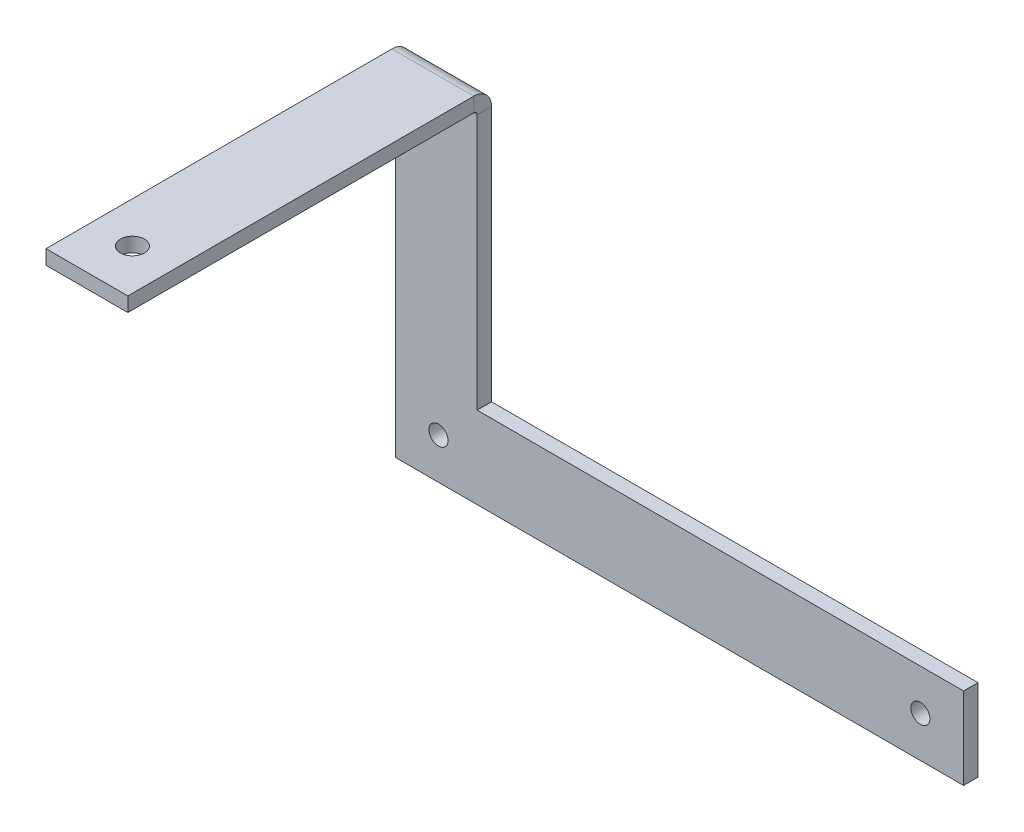
ISO-10303-21;
HEADER;
FILE_DESCRIPTION(('STEP AP214'),'2;1');
FILE_NAME('part.step','',(''),(''),'','','');
FILE_SCHEMA(('AUTOMOTIVE_DESIGN { 1 0 10303 214 1 1 1 1 }'));
ENDSEC;
DATA;
#1=APPLICATION_CONTEXT('core data for automotive mechanical design processes');
#2=APPLICATION_PROTOCOL_DEFINITION('international standard','automotive_design',2000,#1);
#3=PRODUCT_CONTEXT('',#1,'mechanical');
#4=PRODUCT('Part','Part','',(#3));
#5=PRODUCT_RELATED_PRODUCT_CATEGORY('part','',(#4));
#6=PRODUCT_DEFINITION_FORMATION('','',#4);
#7=PRODUCT_DEFINITION_CONTEXT('part definition',#1,'design');
#8=PRODUCT_DEFINITION('design','',#6,#7);
#9=PRODUCT_DEFINITION_SHAPE('','',#8);
#10=(LENGTH_UNIT() NAMED_UNIT(*) SI_UNIT(.MILLI.,.METRE.));
#11=(NAMED_UNIT(*) PLANE_ANGLE_UNIT() SI_UNIT($,.RADIAN.));
#12=(NAMED_UNIT(*) SI_UNIT($,.STERADIAN.) SOLID_ANGLE_UNIT());
#13=UNCERTAINTY_MEASURE_WITH_UNIT(LENGTH_MEASURE(1.E-05),#10,'distance_accuracy_value','');
#14=(GEOMETRIC_REPRESENTATION_CONTEXT(3) GLOBAL_UNCERTAINTY_ASSIGNED_CONTEXT((#13)) GLOBAL_UNIT_ASSIGNED_CONTEXT((#10,
#11,#12)) REPRESENTATION_CONTEXT('',''));
#15=CARTESIAN_POINT('',(0.,0.,0.));
#16=DIRECTION('',(0.,0.,1.));
#17=DIRECTION('',(1.,0.,0.));
#18=AXIS2_PLACEMENT_3D('',#15,#16,#17);
#19=CARTESIAN_POINT('',(0.,75.,-3.175));
#20=DIRECTION('',(-1.,0.,0.));
#21=DIRECTION('',(0.,0.,1.));
#22=AXIS2_PLACEMENT_3D('',#19,#20,#21);
#23=PLANE('',#22);
#24=DIRECTION('',(0.,-1.,0.));
#25=VECTOR('',#24,1.);
#26=CARTESIAN_POINT('',(0.,75.,0.));
#27=LINE('',#26,#25);
#28=CARTESIAN_POINT('',(0.,74.2634,0.));
#29=VERTEX_POINT('',#28);
#30=CARTESIAN_POINT('',(0.,0.,0.));
#31=VERTEX_POINT('',#30);
#32=EDGE_CURVE('E94',#29,#31,#27,.T.);
#33=ORIENTED_EDGE('',*,*,#32,.F.);
#34=DIRECTION('',(0.,0.,-1.));
#35=VECTOR('',#34,1.);
#36=CARTESIAN_POINT('',(0.,74.2634,0.));
#37=LINE('',#36,#35);
#38=CARTESIAN_POINT('',(0.,74.2634,-3.175));
#39=VERTEX_POINT('',#38);
#40=EDGE_CURVE('E190',#29,#39,#37,.T.);
#41=ORIENTED_EDGE('',*,*,#40,.T.);
#42=DIRECTION('',(0.,-1.,0.));
#43=VECTOR('',#42,1.);
#44=CARTESIAN_POINT('',(0.,75.,-3.175));
#45=LINE('',#44,#43);
#46=CARTESIAN_POINT('',(0.,0.,-3.175));
#47=VERTEX_POINT('',#46);
#48=EDGE_CURVE('E75',#39,#47,#45,.T.);
#49=ORIENTED_EDGE('',*,*,#48,.T.);
#50=DIRECTION('',(0.,0.,1.));
#51=VECTOR('',#50,1.);
#52=CARTESIAN_POINT('',(0.,0.,-3.175));
#53=LINE('',#52,#51);
#54=EDGE_CURVE('E11',#47,#31,#53,.T.);
#55=ORIENTED_EDGE('',*,*,#54,.T.);
#56=EDGE_LOOP('',(#33,#41,#49,#55));
#57=FACE_BOUND('',#56,.T.);
#58=ADVANCED_FACE('F49',(#57),#23,.T.);
#59=CARTESIAN_POINT('',(0.,0.,-3.175));
#60=DIRECTION('',(0.,0.,1.));
#61=DIRECTION('',(1.,0.,0.));
#62=AXIS2_PLACEMENT_3D('',#59,#60,#61);
#63=PLANE('',#62);
#64=CARTESIAN_POINT('',(9.5,9.,-3.175));
#65=DIRECTION('',(0.,0.,1.));
#66=DIRECTION('',(1.,0.,0.));
#67=AXIS2_PLACEMENT_3D('',#64,#65,#66);
#68=CIRCLE('',#67,2.09999999999999);
#69=CARTESIAN_POINT('',(11.6,9.,-3.175));
#70=VERTEX_POINT('',#69);
#71=EDGE_CURVE('E339',#70,#70,#68,.T.);
#72=ORIENTED_EDGE('',*,*,#71,.T.);
#73=EDGE_LOOP('',(#72));
#74=FACE_BOUND('',#73,.T.);
#75=CARTESIAN_POINT('',(115.5,9.,-3.175));
#76=DIRECTION('',(0.,0.,1.));
#77=DIRECTION('',(1.,0.,0.));
#78=AXIS2_PLACEMENT_3D('',#75,#76,#77);
#79=CIRCLE('',#78,2.09999999999999);
#80=CARTESIAN_POINT('',(117.6,9.,-3.175));
#81=VERTEX_POINT('',#80);
#82=EDGE_CURVE('E350',#81,#81,#79,.T.);
#83=ORIENTED_EDGE('',*,*,#82,.T.);
#84=EDGE_LOOP('',(#83));
#85=FACE_BOUND('',#84,.T.);
#86=DIRECTION('',(-1.,0.,0.));
#87=VECTOR('',#86,1.);
#88=CARTESIAN_POINT('',(0.,74.2634,-3.175));
#89=LINE('',#88,#87);
#90=CARTESIAN_POINT('',(18.,74.2634,-3.175));
#91=VERTEX_POINT('',#90);
#92=EDGE_CURVE('E182',#39,#91,#89,.F.);
#93=ORIENTED_EDGE('',*,*,#92,.T.);
#94=DIRECTION('',(0.,1.,0.));
#95=VECTOR('',#94,1.);
#96=CARTESIAN_POINT('',(18.,18.,-3.175));
#97=LINE('',#96,#95);
#98=CARTESIAN_POINT('',(18.,18.,-3.175));
#99=VERTEX_POINT('',#98);
#100=EDGE_CURVE('E221',#99,#91,#97,.T.);
#101=ORIENTED_EDGE('',*,*,#100,.F.);
#102=DIRECTION('',(-1.,0.,0.));
#103=VECTOR('',#102,1.);
#104=CARTESIAN_POINT('',(18.,18.,-3.175));
#105=LINE('',#104,#103);
#106=CARTESIAN_POINT('',(125.,18.,-3.175));
#107=VERTEX_POINT('',#106);
#108=EDGE_CURVE('E217',#107,#99,#105,.T.);
#109=ORIENTED_EDGE('',*,*,#108,.F.);
#110=DIRECTION('',(0.,1.,0.));
#111=VECTOR('',#110,1.);
#112=CARTESIAN_POINT('',(125.,0.,-3.175));
#113=LINE('',#112,#111);
#114=CARTESIAN_POINT('',(125.,0.,-3.175));
#115=VERTEX_POINT('',#114);
#116=EDGE_CURVE('E214',#115,#107,#113,.T.);
#117=ORIENTED_EDGE('',*,*,#116,.F.);
#118=DIRECTION('',(1.,0.,0.));
#119=VECTOR('',#118,1.);
#120=CARTESIAN_POINT('',(0.,0.,-3.175));
#121=LINE('',#120,#119);
#122=EDGE_CURVE('E210',#47,#115,#121,.T.);
#123=ORIENTED_EDGE('',*,*,#122,.F.);
#124=ORIENTED_EDGE('',*,*,#48,.F.);
#125=EDGE_LOOP('',(#93,#101,#109,#117,#123,#124));
#126=FACE_BOUND('',#125,.T.);
#127=ADVANCED_FACE('F255',(#74,#85,#126),#63,.F.);
#128=CARTESIAN_POINT('',(0.,0.,0.));
#129=DIRECTION('',(0.,0.,1.));
#130=DIRECTION('',(1.,0.,0.));
#131=AXIS2_PLACEMENT_3D('',#128,#129,#130);
#132=PLANE('',#131);
#133=CARTESIAN_POINT('',(9.5,9.,0.));
#134=DIRECTION('',(0.,0.,1.));
#135=DIRECTION('',(1.,0.,0.));
#136=AXIS2_PLACEMENT_3D('',#133,#134,#135);
#137=CIRCLE('',#136,2.09999999999999);
#138=CARTESIAN_POINT('',(11.6,9.,0.));
#139=VERTEX_POINT('',#138);
#140=EDGE_CURVE('E335',#139,#139,#137,.T.);
#141=ORIENTED_EDGE('',*,*,#140,.F.);
#142=EDGE_LOOP('',(#141));
#143=FACE_BOUND('',#142,.T.);
#144=CARTESIAN_POINT('',(115.5,9.,0.));
#145=DIRECTION('',(0.,0.,1.));
#146=DIRECTION('',(1.,0.,0.));
#147=AXIS2_PLACEMENT_3D('',#144,#145,#146);
#148=CIRCLE('',#147,2.09999999999999);
#149=CARTESIAN_POINT('',(117.6,9.,0.));
#150=VERTEX_POINT('',#149);
#151=EDGE_CURVE('E346',#150,#150,#148,.T.);
#152=ORIENTED_EDGE('',*,*,#151,.F.);
#153=EDGE_LOOP('',(#152));
#154=FACE_BOUND('',#153,.T.);
#155=DIRECTION('',(0.,1.,0.));
#156=VECTOR('',#155,1.);
#157=CARTESIAN_POINT('',(18.,18.,0.));
#158=LINE('',#157,#156);
#159=CARTESIAN_POINT('',(18.,18.,0.));
#160=VERTEX_POINT('',#159);
#161=CARTESIAN_POINT('',(18.,74.2634,0.));
#162=VERTEX_POINT('',#161);
#163=EDGE_CURVE('E237',#160,#162,#158,.T.);
#164=ORIENTED_EDGE('',*,*,#163,.T.);
#165=DIRECTION('',(-1.,0.,0.));
#166=VECTOR('',#165,1.);
#167=CARTESIAN_POINT('',(0.,74.2634,0.));
#168=LINE('',#167,#166);
#169=EDGE_CURVE('E67',#29,#162,#168,.F.);
#170=ORIENTED_EDGE('',*,*,#169,.F.);
#171=ORIENTED_EDGE('',*,*,#32,.T.);
#172=DIRECTION('',(1.,0.,0.));
#173=VECTOR('',#172,1.);
#174=CARTESIAN_POINT('',(0.,0.,0.));
#175=LINE('',#174,#173);
#176=CARTESIAN_POINT('',(125.,0.,0.));
#177=VERTEX_POINT('',#176);
#178=EDGE_CURVE('E207',#31,#177,#175,.T.);
#179=ORIENTED_EDGE('',*,*,#178,.T.);
#180=DIRECTION('',(0.,1.,0.));
#181=VECTOR('',#180,1.);
#182=CARTESIAN_POINT('',(125.,0.,0.));
#183=LINE('',#182,#181);
#184=CARTESIAN_POINT('',(125.,18.,0.));
#185=VERTEX_POINT('',#184);
#186=EDGE_CURVE('E229',#177,#185,#183,.T.);
#187=ORIENTED_EDGE('',*,*,#186,.T.);
#188=DIRECTION('',(-1.,0.,0.));
#189=VECTOR('',#188,1.);
#190=CARTESIAN_POINT('',(18.,18.,0.));
#191=LINE('',#190,#189);
#192=EDGE_CURVE('E233',#185,#160,#191,.T.);
#193=ORIENTED_EDGE('',*,*,#192,.T.);
#194=EDGE_LOOP('',(#164,#170,#171,#179,#187,#193));
#195=FACE_BOUND('',#194,.T.);
#196=ADVANCED_FACE('F252',(#143,#154,#195),#132,.T.);
#197=CARTESIAN_POINT('',(0.,0.,-3.175));
#198=DIRECTION('',(0.,-1.,0.));
#199=DIRECTION('',(0.,0.,-1.));
#200=AXIS2_PLACEMENT_3D('',#197,#198,#199);
#201=PLANE('',#200);
#202=ORIENTED_EDGE('',*,*,#178,.F.);
#203=ORIENTED_EDGE('',*,*,#54,.F.);
#204=ORIENTED_EDGE('',*,*,#122,.T.);
#205=DIRECTION('',(0.,0.,1.));
#206=VECTOR('',#205,1.);
#207=CARTESIAN_POINT('',(125.,0.,-3.175));
#208=LINE('',#207,#206);
#209=EDGE_CURVE('E100',#115,#177,#208,.T.);
#210=ORIENTED_EDGE('',*,*,#209,.T.);
#211=EDGE_LOOP('',(#202,#203,#204,#210));
#212=FACE_BOUND('',#211,.T.);
#213=ADVANCED_FACE('F51',(#212),#201,.T.);
#214=CARTESIAN_POINT('',(18.,18.,-3.175));
#215=DIRECTION('',(1.,0.,0.));
#216=DIRECTION('',(0.,0.,-1.));
#217=AXIS2_PLACEMENT_3D('',#214,#215,#216);
#218=PLANE('',#217);
#219=DIRECTION('',(0.,0.,-1.));
#220=VECTOR('',#219,1.);
#221=CARTESIAN_POINT('',(18.,74.2634,0.));
#222=LINE('',#221,#220);
#223=EDGE_CURVE('E203',#162,#91,#222,.T.);
#224=ORIENTED_EDGE('',*,*,#223,.F.);
#225=ORIENTED_EDGE('',*,*,#163,.F.);
#226=DIRECTION('',(0.,0.,1.));
#227=VECTOR('',#226,1.);
#228=CARTESIAN_POINT('',(18.,18.,-3.175));
#229=LINE('',#228,#227);
#230=EDGE_CURVE('E59',#99,#160,#229,.T.);
#231=ORIENTED_EDGE('',*,*,#230,.F.);
#232=ORIENTED_EDGE('',*,*,#100,.T.);
#233=EDGE_LOOP('',(#224,#225,#231,#232));
#234=FACE_BOUND('',#233,.T.);
#235=ADVANCED_FACE('F263',(#234),#218,.T.);
#236=CARTESIAN_POINT('',(18.,18.,-3.175));
#237=DIRECTION('',(0.,1.,0.));
#238=DIRECTION('',(0.,0.,1.));
#239=AXIS2_PLACEMENT_3D('',#236,#237,#238);
#240=PLANE('',#239);
#241=ORIENTED_EDGE('',*,*,#192,.F.);
#242=DIRECTION('',(0.,0.,1.));
#243=VECTOR('',#242,1.);
#244=CARTESIAN_POINT('',(125.,18.,-3.175));
#245=LINE('',#244,#243);
#246=EDGE_CURVE('E244',#107,#185,#245,.T.);
#247=ORIENTED_EDGE('',*,*,#246,.F.);
#248=ORIENTED_EDGE('',*,*,#108,.T.);
#249=ORIENTED_EDGE('',*,*,#230,.T.);
#250=EDGE_LOOP('',(#241,#247,#248,#249));
#251=FACE_BOUND('',#250,.T.);
#252=ADVANCED_FACE('F276',(#251),#240,.T.);
#253=CARTESIAN_POINT('',(125.,0.,-3.175));
#254=DIRECTION('',(1.,0.,0.));
#255=DIRECTION('',(0.,0.,-1.));
#256=AXIS2_PLACEMENT_3D('',#253,#254,#255);
#257=PLANE('',#256);
#258=ORIENTED_EDGE('',*,*,#186,.F.);
#259=ORIENTED_EDGE('',*,*,#209,.F.);
#260=ORIENTED_EDGE('',*,*,#116,.T.);
#261=ORIENTED_EDGE('',*,*,#246,.T.);
#262=EDGE_LOOP('',(#258,#259,#260,#261));
#263=FACE_BOUND('',#262,.T.);
#264=ADVANCED_FACE('F250',(#263),#257,.T.);
#265=CARTESIAN_POINT('',(18.,74.2634,0.736600000000006));
#266=DIRECTION('',(1.,0.,0.));
#267=DIRECTION('',(0.,0.,-1.));
#268=AXIS2_PLACEMENT_3D('',#265,#266,#267);
#269=PLANE('',#268);
#270=DIRECTION('',(0.,1.,0.));
#271=VECTOR('',#270,1.);
#272=CARTESIAN_POINT('',(18.,75.,0.736600000000004));
#273=LINE('',#272,#271);
#274=CARTESIAN_POINT('',(18.,75.,0.736600000000004));
#275=VERTEX_POINT('',#274);
#276=CARTESIAN_POINT('',(18.,78.175,0.736599999999993));
#277=VERTEX_POINT('',#276);
#278=EDGE_CURVE('E144',#275,#277,#273,.T.);
#279=ORIENTED_EDGE('',*,*,#278,.F.);
#280=CARTESIAN_POINT('',(18.,74.2634,0.736600000000006));
#281=DIRECTION('',(-1.,0.,0.));
#282=DIRECTION('',(0.,0.,1.));
#283=AXIS2_PLACEMENT_3D('',#280,#281,#282);
#284=CIRCLE('',#283,0.736600000000004);
#285=EDGE_CURVE('E194',#162,#275,#284,.F.);
#286=ORIENTED_EDGE('',*,*,#285,.F.);
#287=ORIENTED_EDGE('',*,*,#223,.T.);
#288=CARTESIAN_POINT('',(18.,74.2634,0.736600000000006));
#289=DIRECTION('',(-1.,0.,0.));
#290=DIRECTION('',(0.,0.,1.));
#291=AXIS2_PLACEMENT_3D('',#288,#289,#290);
#292=CIRCLE('',#291,3.9116);
#293=EDGE_CURVE('E185',#91,#277,#292,.F.);
#294=ORIENTED_EDGE('',*,*,#293,.T.);
#295=EDGE_LOOP('',(#279,#286,#287,#294));
#296=FACE_BOUND('',#295,.T.);
#297=ADVANCED_FACE('F280',(#296),#269,.T.);
#298=CARTESIAN_POINT('',(0.,74.2634,0.736600000000006));
#299=DIRECTION('',(1.,0.,0.));
#300=DIRECTION('',(0.,0.,-1.));
#301=AXIS2_PLACEMENT_3D('',#298,#299,#300);
#302=PLANE('',#301);
#303=CARTESIAN_POINT('',(0.,74.2634,0.736600000000006));
#304=DIRECTION('',(-1.,0.,0.));
#305=DIRECTION('',(0.,0.,1.));
#306=AXIS2_PLACEMENT_3D('',#303,#304,#305);
#307=CIRCLE('',#306,0.736600000000004);
#308=CARTESIAN_POINT('',(0.,75.,0.736600000000004));
#309=VERTEX_POINT('',#308);
#310=EDGE_CURVE('E180',#309,#29,#307,.T.);
#311=ORIENTED_EDGE('',*,*,#310,.F.);
#312=DIRECTION('',(0.,1.,0.));
#313=VECTOR('',#312,1.);
#314=CARTESIAN_POINT('',(0.,75.,0.736600000000004));
#315=LINE('',#314,#313);
#316=CARTESIAN_POINT('',(0.,78.175,0.736599999999993));
#317=VERTEX_POINT('',#316);
#318=EDGE_CURVE('E357',#309,#317,#315,.T.);
#319=ORIENTED_EDGE('',*,*,#318,.T.);
#320=CARTESIAN_POINT('',(0.,74.2634,0.736600000000006));
#321=DIRECTION('',(-1.,0.,0.));
#322=DIRECTION('',(0.,0.,1.));
#323=AXIS2_PLACEMENT_3D('',#320,#321,#322);
#324=CIRCLE('',#323,3.9116);
#325=EDGE_CURVE('E186',#317,#39,#324,.T.);
#326=ORIENTED_EDGE('',*,*,#325,.T.);
#327=ORIENTED_EDGE('',*,*,#40,.F.);
#328=EDGE_LOOP('',(#311,#319,#326,#327));
#329=FACE_BOUND('',#328,.T.);
#330=ADVANCED_FACE('F284',(#329),#302,.F.);
#331=CARTESIAN_POINT('',(0.,74.2634,0.736600000000006));
#332=DIRECTION('',(-1.,0.,0.));
#333=DIRECTION('',(0.,1.,0.));
#334=AXIS2_PLACEMENT_3D('',#331,#332,#333);
#335=CYLINDRICAL_SURFACE('',#334,3.9116);
#336=ORIENTED_EDGE('',*,*,#92,.F.);
#337=ORIENTED_EDGE('',*,*,#325,.F.);
#338=DIRECTION('',(-1.,0.,0.));
#339=VECTOR('',#338,1.);
#340=CARTESIAN_POINT('',(0.,78.175,0.736599999999993));
#341=LINE('',#340,#339);
#342=EDGE_CURVE('E173',#277,#317,#341,.T.);
#343=ORIENTED_EDGE('',*,*,#342,.F.);
#344=ORIENTED_EDGE('',*,*,#293,.F.);
#345=EDGE_LOOP('',(#336,#337,#343,#344));
#346=FACE_BOUND('',#345,.T.);
#347=ADVANCED_FACE('F290',(#346),#335,.T.);
#348=CARTESIAN_POINT('',(0.,74.2634,0.736600000000006));
#349=DIRECTION('',(-1.,0.,0.));
#350=DIRECTION('',(0.,1.,0.));
#351=AXIS2_PLACEMENT_3D('',#348,#349,#350);
#352=CYLINDRICAL_SURFACE('',#351,0.736600000000004);
#353=ORIENTED_EDGE('',*,*,#169,.T.);
#354=ORIENTED_EDGE('',*,*,#285,.T.);
#355=DIRECTION('',(-1.,0.,0.));
#356=VECTOR('',#355,1.);
#357=CARTESIAN_POINT('',(18.,75.,0.736600000000004));
#358=LINE('',#357,#356);
#359=EDGE_CURVE('E354',#275,#309,#358,.T.);
#360=ORIENTED_EDGE('',*,*,#359,.T.);
#361=ORIENTED_EDGE('',*,*,#310,.T.);
#362=EDGE_LOOP('',(#353,#354,#360,#361));
#363=FACE_BOUND('',#362,.T.);
#364=ADVANCED_FACE('F294',(#363),#352,.F.);
#365=CARTESIAN_POINT('',(0.,78.175,0.));
#366=DIRECTION('',(-1.,0.,0.));
#367=DIRECTION('',(0.,0.,1.));
#368=AXIS2_PLACEMENT_3D('',#365,#366,#367);
#369=PLANE('',#368);
#370=DIRECTION('',(0.,0.,-1.));
#371=VECTOR('',#370,1.);
#372=CARTESIAN_POINT('',(0.,78.175,0.));
#373=LINE('',#372,#371);
#374=CARTESIAN_POINT('',(0.,78.1750000000003,76.825));
#375=VERTEX_POINT('',#374);
#376=EDGE_CURVE('E160',#375,#317,#373,.T.);
#377=ORIENTED_EDGE('',*,*,#376,.T.);
#378=ORIENTED_EDGE('',*,*,#318,.F.);
#379=DIRECTION('',(0.,0.,-1.));
#380=VECTOR('',#379,1.);
#381=CARTESIAN_POINT('',(0.,75.,0.));
#382=LINE('',#381,#380);
#383=CARTESIAN_POINT('',(0.,75.0000000000003,76.825));
#384=VERTEX_POINT('',#383);
#385=EDGE_CURVE('E150',#384,#309,#382,.T.);
#386=ORIENTED_EDGE('',*,*,#385,.F.);
#387=DIRECTION('',(0.,-1.,0.));
#388=VECTOR('',#387,1.);
#389=CARTESIAN_POINT('',(0.,78.1750000000003,76.825));
#390=LINE('',#389,#388);
#391=EDGE_CURVE('E159',#375,#384,#390,.T.);
#392=ORIENTED_EDGE('',*,*,#391,.F.);
#393=EDGE_LOOP('',(#377,#378,#386,#392));
#394=FACE_BOUND('',#393,.T.);
#395=ADVANCED_FACE('F297',(#394),#369,.T.);
#396=CARTESIAN_POINT('',(18.,78.1750000000003,76.825));
#397=DIRECTION('',(1.,0.,0.));
#398=DIRECTION('',(0.,0.,-1.));
#399=AXIS2_PLACEMENT_3D('',#396,#397,#398);
#400=PLANE('',#399);
#401=DIRECTION('',(0.,0.,1.));
#402=VECTOR('',#401,1.);
#403=CARTESIAN_POINT('',(18.,75.0000000000003,76.825));
#404=LINE('',#403,#402);
#405=CARTESIAN_POINT('',(18.,75.0000000000003,76.825));
#406=VERTEX_POINT('',#405);
#407=EDGE_CURVE('E170',#275,#406,#404,.T.);
#408=ORIENTED_EDGE('',*,*,#407,.F.);
#409=ORIENTED_EDGE('',*,*,#278,.T.);
#410=DIRECTION('',(0.,0.,1.));
#411=VECTOR('',#410,1.);
#412=CARTESIAN_POINT('',(18.,78.1750000000003,76.825));
#413=LINE('',#412,#411);
#414=CARTESIAN_POINT('',(18.,78.1750000000003,76.825));
#415=VERTEX_POINT('',#414);
#416=EDGE_CURVE('E138',#277,#415,#413,.T.);
#417=ORIENTED_EDGE('',*,*,#416,.T.);
#418=DIRECTION('',(0.,-1.,0.));
#419=VECTOR('',#418,1.);
#420=CARTESIAN_POINT('',(18.,78.1750000000003,76.825));
#421=LINE('',#420,#419);
#422=EDGE_CURVE('E142',#415,#406,#421,.T.);
#423=ORIENTED_EDGE('',*,*,#422,.T.);
#424=EDGE_LOOP('',(#408,#409,#417,#423));
#425=FACE_BOUND('',#424,.T.);
#426=ADVANCED_FACE('F141',(#425),#400,.T.);
#427=CARTESIAN_POINT('',(0.,78.175,-2.68499675523988E-13));
#428=DIRECTION('',(0.,1.,0.));
#429=DIRECTION('',(0.,0.,1.));
#430=AXIS2_PLACEMENT_3D('',#427,#428,#429);
#431=PLANE('',#430);
#432=CARTESIAN_POINT('',(8.99999999999999,78.1750000000002,66.825));
#433=DIRECTION('',(0.,1.,0.));
#434=DIRECTION('',(0.,0.,1.));
#435=AXIS2_PLACEMENT_3D('',#432,#433,#434);
#436=CIRCLE('',#435,2.65);
#437=CARTESIAN_POINT('',(8.99999999999999,78.1750000000002,69.475));
#438=VERTEX_POINT('',#437);
#439=EDGE_CURVE('E331',#438,#438,#436,.T.);
#440=ORIENTED_EDGE('',*,*,#439,.F.);
#441=EDGE_LOOP('',(#440));
#442=FACE_BOUND('',#441,.T.);
#443=ORIENTED_EDGE('',*,*,#416,.F.);
#444=ORIENTED_EDGE('',*,*,#342,.T.);
#445=ORIENTED_EDGE('',*,*,#376,.F.);
#446=DIRECTION('',(-1.,0.,0.));
#447=VECTOR('',#446,1.);
#448=CARTESIAN_POINT('',(0.,78.1750000000003,76.825));
#449=LINE('',#448,#447);
#450=EDGE_CURVE('E149',#415,#375,#449,.T.);
#451=ORIENTED_EDGE('',*,*,#450,.F.);
#452=EDGE_LOOP('',(#443,#444,#445,#451));
#453=FACE_BOUND('',#452,.T.);
#454=ADVANCED_FACE('F162',(#442,#453),#431,.T.);
#455=CARTESIAN_POINT('',(0.,75.,-2.57414222273161E-13));
#456=DIRECTION('',(0.,1.,0.));
#457=DIRECTION('',(0.,0.,1.));
#458=AXIS2_PLACEMENT_3D('',#455,#456,#457);
#459=PLANE('',#458);
#460=CARTESIAN_POINT('',(8.99999999999999,75.0000000000002,66.825));
#461=DIRECTION('',(0.,1.,0.));
#462=DIRECTION('',(0.,0.,1.));
#463=AXIS2_PLACEMENT_3D('',#460,#461,#462);
#464=CIRCLE('',#463,2.65);
#465=CARTESIAN_POINT('',(8.99999999999999,75.0000000000002,69.475));
#466=VERTEX_POINT('',#465);
#467=EDGE_CURVE('E53',#466,#466,#464,.T.);
#468=ORIENTED_EDGE('',*,*,#467,.T.);
#469=EDGE_LOOP('',(#468));
#470=FACE_BOUND('',#469,.T.);
#471=ORIENTED_EDGE('',*,*,#359,.F.);
#472=ORIENTED_EDGE('',*,*,#407,.T.);
#473=DIRECTION('',(-1.,0.,0.));
#474=VECTOR('',#473,1.);
#475=CARTESIAN_POINT('',(0.,75.0000000000003,76.825));
#476=LINE('',#475,#474);
#477=EDGE_CURVE('E157',#406,#384,#476,.T.);
#478=ORIENTED_EDGE('',*,*,#477,.T.);
#479=ORIENTED_EDGE('',*,*,#385,.T.);
#480=EDGE_LOOP('',(#471,#472,#478,#479));
#481=FACE_BOUND('',#480,.T.);
#482=ADVANCED_FACE('F307',(#470,#481),#459,.F.);
#483=CARTESIAN_POINT('',(0.,78.1750000000003,76.825));
#484=DIRECTION('',(0.,0.,1.));
#485=DIRECTION('',(0.,-1.,0.));
#486=AXIS2_PLACEMENT_3D('',#483,#484,#485);
#487=PLANE('',#486);
#488=ORIENTED_EDGE('',*,*,#477,.F.);
#489=ORIENTED_EDGE('',*,*,#422,.F.);
#490=ORIENTED_EDGE('',*,*,#450,.T.);
#491=ORIENTED_EDGE('',*,*,#391,.T.);
#492=EDGE_LOOP('',(#488,#489,#490,#491));
#493=FACE_BOUND('',#492,.T.);
#494=ADVANCED_FACE('F154',(#493),#487,.T.);
#495=CARTESIAN_POINT('',(115.5,9.,0.));
#496=DIRECTION('',(0.,0.,1.));
#497=DIRECTION('',(1.,0.,0.));
#498=AXIS2_PLACEMENT_3D('',#495,#496,#497);
#499=CYLINDRICAL_SURFACE('',#498,2.09999999999999);
#500=ORIENTED_EDGE('',*,*,#82,.F.);
#501=EDGE_LOOP('',(#500));
#502=FACE_BOUND('',#501,.T.);
#503=ORIENTED_EDGE('',*,*,#151,.T.);
#504=EDGE_LOOP('',(#503));
#505=FACE_BOUND('',#504,.T.);
#506=ADVANCED_FACE('F306',(#502,#505),#499,.F.);
#507=CARTESIAN_POINT('',(9.5,9.,0.));
#508=DIRECTION('',(0.,0.,1.));
#509=DIRECTION('',(1.,0.,0.));
#510=AXIS2_PLACEMENT_3D('',#507,#508,#509);
#511=CYLINDRICAL_SURFACE('',#510,2.09999999999999);
#512=ORIENTED_EDGE('',*,*,#71,.F.);
#513=EDGE_LOOP('',(#512));
#514=FACE_BOUND('',#513,.T.);
#515=ORIENTED_EDGE('',*,*,#140,.T.);
#516=EDGE_LOOP('',(#515));
#517=FACE_BOUND('',#516,.T.);
#518=ADVANCED_FACE('F318',(#514,#517),#511,.F.);
#519=CARTESIAN_POINT('',(8.99999999999999,0.,66.8250000000003));
#520=DIRECTION('',(0.,1.,0.));
#521=DIRECTION('',(0.,0.,1.));
#522=AXIS2_PLACEMENT_3D('',#519,#520,#521);
#523=CYLINDRICAL_SURFACE('',#522,2.65);
#524=ORIENTED_EDGE('',*,*,#439,.T.);
#525=EDGE_LOOP('',(#524));
#526=FACE_BOUND('',#525,.T.);
#527=ORIENTED_EDGE('',*,*,#467,.F.);
#528=EDGE_LOOP('',(#527));
#529=FACE_BOUND('',#528,.T.);
#530=ADVANCED_FACE('F322',(#526,#529),#523,.F.);
#531=CLOSED_SHELL('',(#58,#127,#196,#213,#235,#252,#264,#297,#330,#347,#364,#395,#426,#454,#482,
#494,#506,#518,#530));
#532=MANIFOLD_SOLID_BREP('B2',#531);
#533=ADVANCED_BREP_SHAPE_REPRESENTATION('',(#18,#532),#14);
#534=SHAPE_DEFINITION_REPRESENTATION(#9,#533);
ENDSEC;
END-ISO-10303-21;
